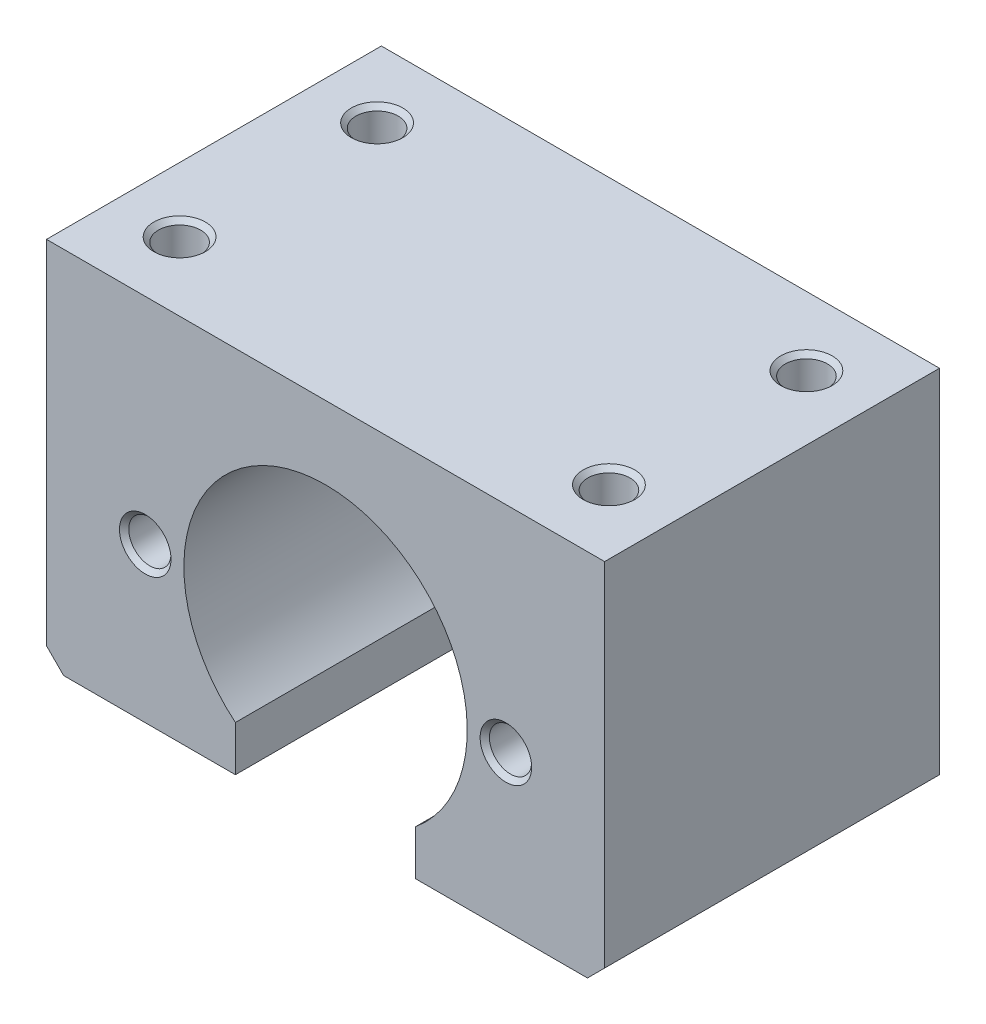
ISO-10303-21;
HEADER;
FILE_DESCRIPTION(('STEP AP214'),'2;1');
FILE_NAME('part.step','',(''),(''),'','','');
FILE_SCHEMA(('AUTOMOTIVE_DESIGN { 1 0 10303 214 1 1 1 1 }'));
ENDSEC;
DATA;
#1=APPLICATION_CONTEXT('core data for automotive mechanical design processes');
#2=APPLICATION_PROTOCOL_DEFINITION('international standard','automotive_design',2000,#1);
#3=PRODUCT_CONTEXT('',#1,'mechanical');
#4=PRODUCT('Part','Part','',(#3));
#5=PRODUCT_RELATED_PRODUCT_CATEGORY('part','',(#4));
#6=PRODUCT_DEFINITION_FORMATION('','',#4);
#7=PRODUCT_DEFINITION_CONTEXT('part definition',#1,'design');
#8=PRODUCT_DEFINITION('design','',#6,#7);
#9=PRODUCT_DEFINITION_SHAPE('','',#8);
#10=(LENGTH_UNIT() NAMED_UNIT(*) SI_UNIT(.MILLI.,.METRE.));
#11=(NAMED_UNIT(*) PLANE_ANGLE_UNIT() SI_UNIT($,.RADIAN.));
#12=(NAMED_UNIT(*) SI_UNIT($,.STERADIAN.) SOLID_ANGLE_UNIT());
#13=UNCERTAINTY_MEASURE_WITH_UNIT(LENGTH_MEASURE(1.E-05),#10,'distance_accuracy_value','');
#14=(GEOMETRIC_REPRESENTATION_CONTEXT(3) GLOBAL_UNCERTAINTY_ASSIGNED_CONTEXT((#13)) GLOBAL_UNIT_ASSIGNED_CONTEXT((#10,
#11,#12)) REPRESENTATION_CONTEXT('',''));
#15=CARTESIAN_POINT('',(0.,0.,0.));
#16=DIRECTION('',(0.,0.,1.));
#17=DIRECTION('',(1.,0.,0.));
#18=AXIS2_PLACEMENT_3D('',#15,#16,#17);
#19=CARTESIAN_POINT('',(32.5,25.,19.5));
#20=DIRECTION('',(0.,-1.,0.));
#21=DIRECTION('',(0.,0.,-1.));
#22=AXIS2_PLACEMENT_3D('',#19,#20,#21);
#23=PLANE('',#22);
#24=CARTESIAN_POINT('',(-25.,25.,11.5));
#25=DIRECTION('',(0.,1.,0.));
#26=DIRECTION('',(0.,0.,1.));
#27=AXIS2_PLACEMENT_3D('',#24,#25,#26);
#28=CIRCLE('',#27,3.);
#29=CARTESIAN_POINT('',(-25.,25.,14.5));
#30=VERTEX_POINT('',#29);
#31=EDGE_CURVE('E157',#30,#30,#28,.T.);
#32=ORIENTED_EDGE('',*,*,#31,.F.);
#33=EDGE_LOOP('',(#32));
#34=FACE_BOUND('',#33,.T.);
#35=CARTESIAN_POINT('',(25.,25.,11.5));
#36=DIRECTION('',(0.,1.,0.));
#37=DIRECTION('',(0.,0.,1.));
#38=AXIS2_PLACEMENT_3D('',#35,#36,#37);
#39=CIRCLE('',#38,3.);
#40=CARTESIAN_POINT('',(25.,25.,14.5));
#41=VERTEX_POINT('',#40);
#42=EDGE_CURVE('E162',#41,#41,#39,.T.);
#43=ORIENTED_EDGE('',*,*,#42,.F.);
#44=EDGE_LOOP('',(#43));
#45=FACE_BOUND('',#44,.T.);
#46=DIRECTION('',(0.,0.,-1.));
#47=VECTOR('',#46,1.);
#48=CARTESIAN_POINT('',(32.5,25.,19.5));
#49=LINE('',#48,#47);
#50=CARTESIAN_POINT('',(32.5,25.,19.5));
#51=VERTEX_POINT('',#50);
#52=CARTESIAN_POINT('',(32.5,25.,-19.5));
#53=VERTEX_POINT('',#52);
#54=EDGE_CURVE('E170',#51,#53,#49,.T.);
#55=ORIENTED_EDGE('',*,*,#54,.T.);
#56=DIRECTION('',(-1.,0.,0.));
#57=VECTOR('',#56,1.);
#58=CARTESIAN_POINT('',(32.5,25.,-19.5));
#59=LINE('',#58,#57);
#60=CARTESIAN_POINT('',(-32.5,25.,-19.5));
#61=VERTEX_POINT('',#60);
#62=EDGE_CURVE('E224',#53,#61,#59,.T.);
#63=ORIENTED_EDGE('',*,*,#62,.T.);
#64=DIRECTION('',(0.,0.,-1.));
#65=VECTOR('',#64,1.);
#66=CARTESIAN_POINT('',(-32.5,25.,19.5));
#67=LINE('',#66,#65);
#68=CARTESIAN_POINT('',(-32.5,25.,19.5));
#69=VERTEX_POINT('',#68);
#70=EDGE_CURVE('E11',#69,#61,#67,.T.);
#71=ORIENTED_EDGE('',*,*,#70,.F.);
#72=DIRECTION('',(-1.,0.,0.));
#73=VECTOR('',#72,1.);
#74=CARTESIAN_POINT('',(32.5,25.,19.5));
#75=LINE('',#74,#73);
#76=EDGE_CURVE('E252',#51,#69,#75,.T.);
#77=ORIENTED_EDGE('',*,*,#76,.F.);
#78=EDGE_LOOP('',(#55,#63,#71,#77));
#79=FACE_BOUND('',#78,.T.);
#80=CARTESIAN_POINT('',(25.,25.,-11.5));
#81=DIRECTION('',(0.,1.,0.));
#82=DIRECTION('',(0.,0.,1.));
#83=AXIS2_PLACEMENT_3D('',#80,#81,#82);
#84=CIRCLE('',#83,3.);
#85=CARTESIAN_POINT('',(25.,25.,-8.5));
#86=VERTEX_POINT('',#85);
#87=EDGE_CURVE('E171',#86,#86,#84,.T.);
#88=ORIENTED_EDGE('',*,*,#87,.F.);
#89=EDGE_LOOP('',(#88));
#90=FACE_BOUND('',#89,.T.);
#91=CARTESIAN_POINT('',(-25.,25.,-11.5));
#92=DIRECTION('',(0.,1.,0.));
#93=DIRECTION('',(0.,0.,1.));
#94=AXIS2_PLACEMENT_3D('',#91,#92,#93);
#95=CIRCLE('',#94,3.);
#96=CARTESIAN_POINT('',(-25.,25.,-8.5));
#97=VERTEX_POINT('',#96);
#98=EDGE_CURVE('E172',#97,#97,#95,.T.);
#99=ORIENTED_EDGE('',*,*,#98,.F.);
#100=EDGE_LOOP('',(#99));
#101=FACE_BOUND('',#100,.T.);
#102=ADVANCED_FACE('F43',(#34,#45,#79,#90,#101),#23,.F.);
#103=CARTESIAN_POINT('',(0.,0.,19.5));
#104=DIRECTION('',(0.,0.,-1.));
#105=DIRECTION('',(-1.,0.,0.));
#106=AXIS2_PLACEMENT_3D('',#103,#104,#105);
#107=PLANE('',#106);
#108=CARTESIAN_POINT('',(21.,0.,19.5));
#109=DIRECTION('',(0.,0.,1.));
#110=DIRECTION('',(1.,0.,0.));
#111=AXIS2_PLACEMENT_3D('',#108,#109,#110);
#112=CIRCLE('',#111,3.);
#113=CARTESIAN_POINT('',(24.,0.,19.5));
#114=VERTEX_POINT('',#113);
#115=EDGE_CURVE('E219',#114,#114,#112,.T.);
#116=ORIENTED_EDGE('',*,*,#115,.F.);
#117=EDGE_LOOP('',(#116));
#118=FACE_BOUND('',#117,.T.);
#119=ORIENTED_EDGE('',*,*,#76,.T.);
#120=DIRECTION('',(0.,-1.,0.));
#121=VECTOR('',#120,1.);
#122=CARTESIAN_POINT('',(-32.5,25.,19.5));
#123=LINE('',#122,#121);
#124=CARTESIAN_POINT('',(-32.5,-16.,19.5));
#125=VERTEX_POINT('',#124);
#126=EDGE_CURVE('E255',#69,#125,#123,.T.);
#127=ORIENTED_EDGE('',*,*,#126,.T.);
#128=DIRECTION('',(0.707106781186547,-0.707106781186547,0.));
#129=VECTOR('',#128,1.);
#130=CARTESIAN_POINT('',(-32.5,-16.,19.5));
#131=LINE('',#130,#129);
#132=CARTESIAN_POINT('',(-30.5,-18.,19.5));
#133=VERTEX_POINT('',#132);
#134=EDGE_CURVE('E258',#125,#133,#131,.T.);
#135=ORIENTED_EDGE('',*,*,#134,.T.);
#136=DIRECTION('',(1.,0.,0.));
#137=VECTOR('',#136,1.);
#138=CARTESIAN_POINT('',(-30.5,-18.,19.5));
#139=LINE('',#138,#137);
#140=CARTESIAN_POINT('',(-10.5,-18.,19.5));
#141=VERTEX_POINT('',#140);
#142=EDGE_CURVE('E256',#133,#141,#139,.T.);
#143=ORIENTED_EDGE('',*,*,#142,.T.);
#144=DIRECTION('',(0.,1.,0.));
#145=VECTOR('',#144,1.);
#146=CARTESIAN_POINT('',(-10.5,-18.,19.5));
#147=LINE('',#146,#145);
#148=CARTESIAN_POINT('',(-10.5,-12.7279220613579,19.5));
#149=VERTEX_POINT('',#148);
#150=EDGE_CURVE('E257',#141,#149,#147,.T.);
#151=ORIENTED_EDGE('',*,*,#150,.T.);
#152=CARTESIAN_POINT('',(0.,0.,19.5));
#153=DIRECTION('',(0.,0.,-1.));
#154=DIRECTION('',(-1.,0.,0.));
#155=AXIS2_PLACEMENT_3D('',#152,#153,#154);
#156=CIRCLE('',#155,16.5);
#157=CARTESIAN_POINT('',(10.5,-12.7279220613578,19.5));
#158=VERTEX_POINT('',#157);
#159=EDGE_CURVE('E265',#149,#158,#156,.T.);
#160=ORIENTED_EDGE('',*,*,#159,.T.);
#161=DIRECTION('',(0.,-1.,0.));
#162=VECTOR('',#161,1.);
#163=CARTESIAN_POINT('',(10.5,-12.7279220613579,19.5));
#164=LINE('',#163,#162);
#165=CARTESIAN_POINT('',(10.5,-18.,19.5));
#166=VERTEX_POINT('',#165);
#167=EDGE_CURVE('E262',#158,#166,#164,.T.);
#168=ORIENTED_EDGE('',*,*,#167,.T.);
#169=DIRECTION('',(1.,0.,0.));
#170=VECTOR('',#169,1.);
#171=CARTESIAN_POINT('',(10.5,-18.,19.5));
#172=LINE('',#171,#170);
#173=CARTESIAN_POINT('',(30.5,-18.,19.5));
#174=VERTEX_POINT('',#173);
#175=EDGE_CURVE('E266',#166,#174,#172,.T.);
#176=ORIENTED_EDGE('',*,*,#175,.T.);
#177=DIRECTION('',(0.707106781186547,0.707106781186547,0.));
#178=VECTOR('',#177,1.);
#179=CARTESIAN_POINT('',(30.5,-18.,19.5));
#180=LINE('',#179,#178);
#181=CARTESIAN_POINT('',(32.5,-16.,19.5));
#182=VERTEX_POINT('',#181);
#183=EDGE_CURVE('E61',#174,#182,#180,.T.);
#184=ORIENTED_EDGE('',*,*,#183,.T.);
#185=DIRECTION('',(0.,1.,0.));
#186=VECTOR('',#185,1.);
#187=CARTESIAN_POINT('',(32.5,-16.,19.5));
#188=LINE('',#187,#186);
#189=EDGE_CURVE('E60',#182,#51,#188,.T.);
#190=ORIENTED_EDGE('',*,*,#189,.T.);
#191=EDGE_LOOP('',(#119,#127,#135,#143,#151,#160,#168,#176,#184,#190));
#192=FACE_BOUND('',#191,.T.);
#193=CARTESIAN_POINT('',(-21.,0.,19.5));
#194=DIRECTION('',(0.,0.,1.));
#195=DIRECTION('',(1.,0.,0.));
#196=AXIS2_PLACEMENT_3D('',#193,#194,#195);
#197=CIRCLE('',#196,3.);
#198=CARTESIAN_POINT('',(-18.,0.,19.5));
#199=VERTEX_POINT('',#198);
#200=EDGE_CURVE('E211',#199,#199,#197,.T.);
#201=ORIENTED_EDGE('',*,*,#200,.F.);
#202=EDGE_LOOP('',(#201));
#203=FACE_BOUND('',#202,.T.);
#204=ADVANCED_FACE('F146',(#118,#192,#203),#107,.F.);
#205=CARTESIAN_POINT('',(-32.5,25.,19.5));
#206=DIRECTION('',(1.,0.,0.));
#207=DIRECTION('',(0.,0.,-1.));
#208=AXIS2_PLACEMENT_3D('',#205,#206,#207);
#209=PLANE('',#208);
#210=ORIENTED_EDGE('',*,*,#70,.T.);
#211=DIRECTION('',(0.,-1.,0.));
#212=VECTOR('',#211,1.);
#213=CARTESIAN_POINT('',(-32.5,25.,-19.5));
#214=LINE('',#213,#212);
#215=CARTESIAN_POINT('',(-32.5,-16.,-19.5));
#216=VERTEX_POINT('',#215);
#217=EDGE_CURVE('E223',#61,#216,#214,.T.);
#218=ORIENTED_EDGE('',*,*,#217,.T.);
#219=DIRECTION('',(0.,0.,-1.));
#220=VECTOR('',#219,1.);
#221=CARTESIAN_POINT('',(-32.5,-16.,19.5));
#222=LINE('',#221,#220);
#223=EDGE_CURVE('E49',#125,#216,#222,.T.);
#224=ORIENTED_EDGE('',*,*,#223,.F.);
#225=ORIENTED_EDGE('',*,*,#126,.F.);
#226=EDGE_LOOP('',(#210,#218,#224,#225));
#227=FACE_BOUND('',#226,.T.);
#228=ADVANCED_FACE('F153',(#227),#209,.F.);
#229=CARTESIAN_POINT('',(-32.5,-16.,19.5));
#230=DIRECTION('',(0.707106781186548,0.707106781186548,0.));
#231=DIRECTION('',(-0.707106781186548,0.707106781186548,0.));
#232=AXIS2_PLACEMENT_3D('',#229,#230,#231);
#233=PLANE('',#232);
#234=ORIENTED_EDGE('',*,*,#223,.T.);
#235=DIRECTION('',(0.707106781186547,-0.707106781186547,0.));
#236=VECTOR('',#235,1.);
#237=CARTESIAN_POINT('',(-32.5,-16.,-19.5));
#238=LINE('',#237,#236);
#239=CARTESIAN_POINT('',(-30.5,-18.,-19.5));
#240=VERTEX_POINT('',#239);
#241=EDGE_CURVE('E230',#216,#240,#238,.T.);
#242=ORIENTED_EDGE('',*,*,#241,.T.);
#243=DIRECTION('',(0.,0.,-1.));
#244=VECTOR('',#243,1.);
#245=CARTESIAN_POINT('',(-30.5,-18.,19.5));
#246=LINE('',#245,#244);
#247=EDGE_CURVE('E285',#133,#240,#246,.T.);
#248=ORIENTED_EDGE('',*,*,#247,.F.);
#249=ORIENTED_EDGE('',*,*,#134,.F.);
#250=EDGE_LOOP('',(#234,#242,#248,#249));
#251=FACE_BOUND('',#250,.T.);
#252=ADVANCED_FACE('F290',(#251),#233,.F.);
#253=CARTESIAN_POINT('',(-30.5,-18.,19.5));
#254=DIRECTION('',(0.,1.,0.));
#255=DIRECTION('',(0.,0.,1.));
#256=AXIS2_PLACEMENT_3D('',#253,#254,#255);
#257=PLANE('',#256);
#258=ORIENTED_EDGE('',*,*,#247,.T.);
#259=DIRECTION('',(1.,0.,0.));
#260=VECTOR('',#259,1.);
#261=CARTESIAN_POINT('',(-30.5,-18.,-19.5));
#262=LINE('',#261,#260);
#263=CARTESIAN_POINT('',(-10.5,-18.,-19.5));
#264=VERTEX_POINT('',#263);
#265=EDGE_CURVE('E234',#240,#264,#262,.T.);
#266=ORIENTED_EDGE('',*,*,#265,.T.);
#267=DIRECTION('',(0.,0.,-1.));
#268=VECTOR('',#267,1.);
#269=CARTESIAN_POINT('',(-10.5,-18.,19.5));
#270=LINE('',#269,#268);
#271=EDGE_CURVE('E284',#141,#264,#270,.T.);
#272=ORIENTED_EDGE('',*,*,#271,.F.);
#273=ORIENTED_EDGE('',*,*,#142,.F.);
#274=EDGE_LOOP('',(#258,#266,#272,#273));
#275=FACE_BOUND('',#274,.T.);
#276=ADVANCED_FACE('F322',(#275),#257,.F.);
#277=CARTESIAN_POINT('',(-10.5,-18.,19.5));
#278=DIRECTION('',(-1.,0.,0.));
#279=DIRECTION('',(0.,0.,1.));
#280=AXIS2_PLACEMENT_3D('',#277,#278,#279);
#281=PLANE('',#280);
#282=ORIENTED_EDGE('',*,*,#271,.T.);
#283=DIRECTION('',(0.,1.,0.));
#284=VECTOR('',#283,1.);
#285=CARTESIAN_POINT('',(-10.5,-18.,-19.5));
#286=LINE('',#285,#284);
#287=CARTESIAN_POINT('',(-10.5,-12.7279220613579,-19.5));
#288=VERTEX_POINT('',#287);
#289=EDGE_CURVE('E233',#264,#288,#286,.T.);
#290=ORIENTED_EDGE('',*,*,#289,.T.);
#291=DIRECTION('',(0.,0.,-1.));
#292=VECTOR('',#291,1.);
#293=CARTESIAN_POINT('',(-10.5,-12.7279220613579,19.5));
#294=LINE('',#293,#292);
#295=EDGE_CURVE('E276',#149,#288,#294,.T.);
#296=ORIENTED_EDGE('',*,*,#295,.F.);
#297=ORIENTED_EDGE('',*,*,#150,.F.);
#298=EDGE_LOOP('',(#282,#290,#296,#297));
#299=FACE_BOUND('',#298,.T.);
#300=ADVANCED_FACE('F321',(#299),#281,.F.);
#301=CARTESIAN_POINT('',(0.,0.,19.5));
#302=DIRECTION('',(0.,0.,-1.));
#303=DIRECTION('',(-1.,0.,0.));
#304=AXIS2_PLACEMENT_3D('',#301,#302,#303);
#305=CYLINDRICAL_SURFACE('',#304,16.5);
#306=ORIENTED_EDGE('',*,*,#295,.T.);
#307=CARTESIAN_POINT('',(0.,0.,-19.5));
#308=DIRECTION('',(0.,0.,-1.));
#309=DIRECTION('',(-1.,0.,0.));
#310=AXIS2_PLACEMENT_3D('',#307,#308,#309);
#311=CIRCLE('',#310,16.5);
#312=CARTESIAN_POINT('',(10.5,-12.7279220613578,-19.5));
#313=VERTEX_POINT('',#312);
#314=EDGE_CURVE('E240',#288,#313,#311,.T.);
#315=ORIENTED_EDGE('',*,*,#314,.T.);
#316=DIRECTION('',(0.,0.,-1.));
#317=VECTOR('',#316,1.);
#318=CARTESIAN_POINT('',(10.5,-12.7279220613578,19.5));
#319=LINE('',#318,#317);
#320=EDGE_CURVE('E280',#158,#313,#319,.T.);
#321=ORIENTED_EDGE('',*,*,#320,.F.);
#322=ORIENTED_EDGE('',*,*,#159,.F.);
#323=EDGE_LOOP('',(#306,#315,#321,#322));
#324=FACE_BOUND('',#323,.T.);
#325=ADVANCED_FACE('F316',(#324),#305,.F.);
#326=CARTESIAN_POINT('',(10.5,-12.7279220613579,19.5));
#327=DIRECTION('',(1.,0.,0.));
#328=DIRECTION('',(0.,0.,-1.));
#329=AXIS2_PLACEMENT_3D('',#326,#327,#328);
#330=PLANE('',#329);
#331=ORIENTED_EDGE('',*,*,#320,.T.);
#332=DIRECTION('',(0.,-1.,0.));
#333=VECTOR('',#332,1.);
#334=CARTESIAN_POINT('',(10.5,-12.7279220613579,-19.5));
#335=LINE('',#334,#333);
#336=CARTESIAN_POINT('',(10.5,-18.,-19.5));
#337=VERTEX_POINT('',#336);
#338=EDGE_CURVE('E238',#313,#337,#335,.T.);
#339=ORIENTED_EDGE('',*,*,#338,.T.);
#340=DIRECTION('',(0.,0.,-1.));
#341=VECTOR('',#340,1.);
#342=CARTESIAN_POINT('',(10.5,-18.,19.5));
#343=LINE('',#342,#341);
#344=EDGE_CURVE('E274',#166,#337,#343,.T.);
#345=ORIENTED_EDGE('',*,*,#344,.F.);
#346=ORIENTED_EDGE('',*,*,#167,.F.);
#347=EDGE_LOOP('',(#331,#339,#345,#346));
#348=FACE_BOUND('',#347,.T.);
#349=ADVANCED_FACE('F315',(#348),#330,.F.);
#350=CARTESIAN_POINT('',(10.5,-18.,19.5));
#351=DIRECTION('',(0.,1.,0.));
#352=DIRECTION('',(0.,0.,1.));
#353=AXIS2_PLACEMENT_3D('',#350,#351,#352);
#354=PLANE('',#353);
#355=ORIENTED_EDGE('',*,*,#344,.T.);
#356=DIRECTION('',(1.,0.,0.));
#357=VECTOR('',#356,1.);
#358=CARTESIAN_POINT('',(10.5,-18.,-19.5));
#359=LINE('',#358,#357);
#360=CARTESIAN_POINT('',(30.5,-18.,-19.5));
#361=VERTEX_POINT('',#360);
#362=EDGE_CURVE('E245',#337,#361,#359,.T.);
#363=ORIENTED_EDGE('',*,*,#362,.T.);
#364=DIRECTION('',(0.,0.,-1.));
#365=VECTOR('',#364,1.);
#366=CARTESIAN_POINT('',(30.5,-18.,19.5));
#367=LINE('',#366,#365);
#368=EDGE_CURVE('E272',#174,#361,#367,.T.);
#369=ORIENTED_EDGE('',*,*,#368,.F.);
#370=ORIENTED_EDGE('',*,*,#175,.F.);
#371=EDGE_LOOP('',(#355,#363,#369,#370));
#372=FACE_BOUND('',#371,.T.);
#373=ADVANCED_FACE('F307',(#372),#354,.F.);
#374=CARTESIAN_POINT('',(30.5,-18.,19.5));
#375=DIRECTION('',(-0.707106781186548,0.707106781186548,0.));
#376=DIRECTION('',(-0.707106781186548,-0.707106781186548,0.));
#377=AXIS2_PLACEMENT_3D('',#374,#375,#376);
#378=PLANE('',#377);
#379=ORIENTED_EDGE('',*,*,#368,.T.);
#380=DIRECTION('',(0.707106781186547,0.707106781186547,0.));
#381=VECTOR('',#380,1.);
#382=CARTESIAN_POINT('',(30.5,-18.,-19.5));
#383=LINE('',#382,#381);
#384=CARTESIAN_POINT('',(32.5,-16.,-19.5));
#385=VERTEX_POINT('',#384);
#386=EDGE_CURVE('E249',#361,#385,#383,.T.);
#387=ORIENTED_EDGE('',*,*,#386,.T.);
#388=DIRECTION('',(0.,0.,-1.));
#389=VECTOR('',#388,1.);
#390=CARTESIAN_POINT('',(32.5,-16.,19.5));
#391=LINE('',#390,#389);
#392=EDGE_CURVE('E271',#182,#385,#391,.T.);
#393=ORIENTED_EDGE('',*,*,#392,.F.);
#394=ORIENTED_EDGE('',*,*,#183,.F.);
#395=EDGE_LOOP('',(#379,#387,#393,#394));
#396=FACE_BOUND('',#395,.T.);
#397=ADVANCED_FACE('F301',(#396),#378,.F.);
#398=CARTESIAN_POINT('',(32.5,-16.,19.5));
#399=DIRECTION('',(-1.,0.,0.));
#400=DIRECTION('',(0.,0.,1.));
#401=AXIS2_PLACEMENT_3D('',#398,#399,#400);
#402=PLANE('',#401);
#403=ORIENTED_EDGE('',*,*,#392,.T.);
#404=DIRECTION('',(0.,1.,0.));
#405=VECTOR('',#404,1.);
#406=CARTESIAN_POINT('',(32.5,-16.,-19.5));
#407=LINE('',#406,#405);
#408=EDGE_CURVE('E248',#385,#53,#407,.T.);
#409=ORIENTED_EDGE('',*,*,#408,.T.);
#410=ORIENTED_EDGE('',*,*,#54,.F.);
#411=ORIENTED_EDGE('',*,*,#189,.F.);
#412=EDGE_LOOP('',(#403,#409,#410,#411));
#413=FACE_BOUND('',#412,.T.);
#414=ADVANCED_FACE('F297',(#413),#402,.F.);
#415=CARTESIAN_POINT('',(0.,0.,-19.5));
#416=DIRECTION('',(0.,0.,-1.));
#417=DIRECTION('',(-1.,0.,0.));
#418=AXIS2_PLACEMENT_3D('',#415,#416,#417);
#419=PLANE('',#418);
#420=ORIENTED_EDGE('',*,*,#62,.F.);
#421=ORIENTED_EDGE('',*,*,#408,.F.);
#422=ORIENTED_EDGE('',*,*,#386,.F.);
#423=ORIENTED_EDGE('',*,*,#362,.F.);
#424=ORIENTED_EDGE('',*,*,#338,.F.);
#425=ORIENTED_EDGE('',*,*,#314,.F.);
#426=ORIENTED_EDGE('',*,*,#289,.F.);
#427=ORIENTED_EDGE('',*,*,#265,.F.);
#428=ORIENTED_EDGE('',*,*,#241,.F.);
#429=ORIENTED_EDGE('',*,*,#217,.F.);
#430=EDGE_LOOP('',(#420,#421,#422,#423,#424,#425,#426,#427,#428,#429));
#431=FACE_BOUND('',#430,.T.);
#432=ADVANCED_FACE('F294',(#431),#419,.T.);
#433=CARTESIAN_POINT('',(21.,0.,18.9585));
#434=DIRECTION('',(0.,0.,1.));
#435=DIRECTION('',(1.,0.,0.));
#436=AXIS2_PLACEMENT_3D('',#433,#434,#435);
#437=CONICAL_SURFACE('',#436,2.4585,0.785398163397448);
#438=ORIENTED_EDGE('',*,*,#115,.T.);
#439=EDGE_LOOP('',(#438));
#440=FACE_BOUND('',#439,.T.);
#441=CARTESIAN_POINT('',(21.,0.,18.9585));
#442=DIRECTION('',(0.,0.,1.));
#443=DIRECTION('',(1.,0.,0.));
#444=AXIS2_PLACEMENT_3D('',#441,#442,#443);
#445=CIRCLE('',#444,2.4585);
#446=CARTESIAN_POINT('',(23.4585,0.,18.9585));
#447=VERTEX_POINT('',#446);
#448=EDGE_CURVE('E220',#447,#447,#445,.T.);
#449=ORIENTED_EDGE('',*,*,#448,.F.);
#450=EDGE_LOOP('',(#449));
#451=FACE_BOUND('',#450,.T.);
#452=ADVANCED_FACE('F363',(#440,#451),#437,.F.);
#453=CARTESIAN_POINT('',(21.,0.,6.08058436319731));
#454=DIRECTION('',(0.,0.,1.));
#455=DIRECTION('',(1.,0.,0.));
#456=AXIS2_PLACEMENT_3D('',#453,#454,#455);
#457=CYLINDRICAL_SURFACE('',#456,2.4585);
#458=ORIENTED_EDGE('',*,*,#448,.T.);
#459=EDGE_LOOP('',(#458));
#460=FACE_BOUND('',#459,.T.);
#461=CARTESIAN_POINT('',(21.,0.,7.5));
#462=DIRECTION('',(0.,0.,1.));
#463=DIRECTION('',(1.,0.,0.));
#464=AXIS2_PLACEMENT_3D('',#461,#462,#463);
#465=CIRCLE('',#464,2.4585);
#466=CARTESIAN_POINT('',(23.4585,0.,7.5));
#467=VERTEX_POINT('',#466);
#468=EDGE_CURVE('E212',#467,#467,#465,.T.);
#469=ORIENTED_EDGE('',*,*,#468,.F.);
#470=EDGE_LOOP('',(#469));
#471=FACE_BOUND('',#470,.T.);
#472=ADVANCED_FACE('F356',(#460,#471),#457,.F.);
#473=CARTESIAN_POINT('',(21.,0.,6.08058436319731));
#474=DIRECTION('',(0.,0.,1.));
#475=DIRECTION('',(1.,0.,0.));
#476=AXIS2_PLACEMENT_3D('',#473,#474,#475);
#477=CONICAL_SURFACE('',#476,0.,1.0471975511966);
#478=ORIENTED_EDGE('',*,*,#468,.T.);
#479=EDGE_LOOP('',(#478));
#480=FACE_BOUND('',#479,.T.);
#481=CARTESIAN_POINT('',(21.,0.,6.08058436319731));
#482=VERTEX_POINT('',#481);
#483=VERTEX_LOOP('',#482);
#484=FACE_BOUND('',#483,.T.);
#485=ADVANCED_FACE('F334',(#480,#484),#477,.F.);
#486=CARTESIAN_POINT('',(-21.,0.,18.9585));
#487=DIRECTION('',(0.,0.,1.));
#488=DIRECTION('',(1.,0.,0.));
#489=AXIS2_PLACEMENT_3D('',#486,#487,#488);
#490=CONICAL_SURFACE('',#489,2.4585,0.785398163397448);
#491=ORIENTED_EDGE('',*,*,#200,.T.);
#492=EDGE_LOOP('',(#491));
#493=FACE_BOUND('',#492,.T.);
#494=CARTESIAN_POINT('',(-21.,0.,18.9585));
#495=DIRECTION('',(0.,0.,1.));
#496=DIRECTION('',(1.,0.,0.));
#497=AXIS2_PLACEMENT_3D('',#494,#495,#496);
#498=CIRCLE('',#497,2.4585);
#499=CARTESIAN_POINT('',(-18.5415,0.,18.9585));
#500=VERTEX_POINT('',#499);
#501=EDGE_CURVE('E208',#500,#500,#498,.T.);
#502=ORIENTED_EDGE('',*,*,#501,.F.);
#503=EDGE_LOOP('',(#502));
#504=FACE_BOUND('',#503,.T.);
#505=ADVANCED_FACE('F328',(#493,#504),#490,.F.);
#506=CARTESIAN_POINT('',(-21.,0.,6.08058436319731));
#507=DIRECTION('',(0.,0.,1.));
#508=DIRECTION('',(1.,0.,0.));
#509=AXIS2_PLACEMENT_3D('',#506,#507,#508);
#510=CYLINDRICAL_SURFACE('',#509,2.4585);
#511=ORIENTED_EDGE('',*,*,#501,.T.);
#512=EDGE_LOOP('',(#511));
#513=FACE_BOUND('',#512,.T.);
#514=CARTESIAN_POINT('',(-21.,0.,7.5));
#515=DIRECTION('',(0.,0.,1.));
#516=DIRECTION('',(1.,0.,0.));
#517=AXIS2_PLACEMENT_3D('',#514,#515,#516);
#518=CIRCLE('',#517,2.4585);
#519=CARTESIAN_POINT('',(-18.5415,0.,7.5));
#520=VERTEX_POINT('',#519);
#521=EDGE_CURVE('E202',#520,#520,#518,.T.);
#522=ORIENTED_EDGE('',*,*,#521,.F.);
#523=EDGE_LOOP('',(#522));
#524=FACE_BOUND('',#523,.T.);
#525=ADVANCED_FACE('F335',(#513,#524),#510,.F.);
#526=CARTESIAN_POINT('',(-21.,0.,6.08058436319731));
#527=DIRECTION('',(0.,0.,1.));
#528=DIRECTION('',(1.,0.,0.));
#529=AXIS2_PLACEMENT_3D('',#526,#527,#528);
#530=CONICAL_SURFACE('',#529,0.,1.0471975511966);
#531=ORIENTED_EDGE('',*,*,#521,.T.);
#532=EDGE_LOOP('',(#531));
#533=FACE_BOUND('',#532,.T.);
#534=CARTESIAN_POINT('',(-21.,0.,6.08058436319731));
#535=VERTEX_POINT('',#534);
#536=VERTEX_LOOP('',#535);
#537=FACE_BOUND('',#536,.T.);
#538=ADVANCED_FACE('F338',(#533,#537),#530,.F.);
#539=CARTESIAN_POINT('',(25.,24.4585,11.5));
#540=DIRECTION('',(0.,1.,0.));
#541=DIRECTION('',(0.,0.,1.));
#542=AXIS2_PLACEMENT_3D('',#539,#540,#541);
#543=CONICAL_SURFACE('',#542,2.4585,0.785398163397447);
#544=ORIENTED_EDGE('',*,*,#42,.T.);
#545=EDGE_LOOP('',(#544));
#546=FACE_BOUND('',#545,.T.);
#547=CARTESIAN_POINT('',(25.,24.4585,11.5));
#548=DIRECTION('',(0.,1.,0.));
#549=DIRECTION('',(0.,0.,1.));
#550=AXIS2_PLACEMENT_3D('',#547,#548,#549);
#551=CIRCLE('',#550,2.4585);
#552=CARTESIAN_POINT('',(25.,24.4585,13.9585));
#553=VERTEX_POINT('',#552);
#554=EDGE_CURVE('E203',#553,#553,#551,.T.);
#555=ORIENTED_EDGE('',*,*,#554,.F.);
#556=EDGE_LOOP('',(#555));
#557=FACE_BOUND('',#556,.T.);
#558=ADVANCED_FACE('F342',(#546,#557),#543,.F.);
#559=CARTESIAN_POINT('',(25.,9.5805843631973,11.5));
#560=DIRECTION('',(0.,1.,0.));
#561=DIRECTION('',(0.,0.,1.));
#562=AXIS2_PLACEMENT_3D('',#559,#560,#561);
#563=CYLINDRICAL_SURFACE('',#562,2.4585);
#564=ORIENTED_EDGE('',*,*,#554,.T.);
#565=EDGE_LOOP('',(#564));
#566=FACE_BOUND('',#565,.T.);
#567=CARTESIAN_POINT('',(25.,11.,11.5));
#568=DIRECTION('',(0.,1.,0.));
#569=DIRECTION('',(0.,0.,1.));
#570=AXIS2_PLACEMENT_3D('',#567,#568,#569);
#571=CIRCLE('',#570,2.4585);
#572=CARTESIAN_POINT('',(25.,11.,13.9585));
#573=VERTEX_POINT('',#572);
#574=EDGE_CURVE('E196',#573,#573,#571,.T.);
#575=ORIENTED_EDGE('',*,*,#574,.F.);
#576=EDGE_LOOP('',(#575));
#577=FACE_BOUND('',#576,.T.);
#578=ADVANCED_FACE('F348',(#566,#577),#563,.F.);
#579=CARTESIAN_POINT('',(25.,9.5805843631973,11.5));
#580=DIRECTION('',(0.,1.,0.));
#581=DIRECTION('',(0.,0.,1.));
#582=AXIS2_PLACEMENT_3D('',#579,#580,#581);
#583=CONICAL_SURFACE('',#582,0.,1.0471975511966);
#584=ORIENTED_EDGE('',*,*,#574,.T.);
#585=EDGE_LOOP('',(#584));
#586=FACE_BOUND('',#585,.T.);
#587=CARTESIAN_POINT('',(25.,9.5805843631973,11.5));
#588=VERTEX_POINT('',#587);
#589=VERTEX_LOOP('',#588);
#590=FACE_BOUND('',#589,.T.);
#591=ADVANCED_FACE('F469',(#586,#590),#583,.F.);
#592=CARTESIAN_POINT('',(25.,24.4585,-11.5));
#593=DIRECTION('',(0.,1.,0.));
#594=DIRECTION('',(0.,0.,1.));
#595=AXIS2_PLACEMENT_3D('',#592,#593,#594);
#596=CONICAL_SURFACE('',#595,2.4585,0.785398163397448);
#597=ORIENTED_EDGE('',*,*,#87,.T.);
#598=EDGE_LOOP('',(#597));
#599=FACE_BOUND('',#598,.T.);
#600=CARTESIAN_POINT('',(25.,24.4585,-11.5));
#601=DIRECTION('',(0.,1.,0.));
#602=DIRECTION('',(0.,0.,1.));
#603=AXIS2_PLACEMENT_3D('',#600,#601,#602);
#604=CIRCLE('',#603,2.4585);
#605=CARTESIAN_POINT('',(25.,24.4585,-9.0415));
#606=VERTEX_POINT('',#605);
#607=EDGE_CURVE('E193',#606,#606,#604,.T.);
#608=ORIENTED_EDGE('',*,*,#607,.F.);
#609=EDGE_LOOP('',(#608));
#610=FACE_BOUND('',#609,.T.);
#611=ADVANCED_FACE('F478',(#599,#610),#596,.F.);
#612=CARTESIAN_POINT('',(25.,9.58058436319731,-11.5));
#613=DIRECTION('',(0.,1.,0.));
#614=DIRECTION('',(0.,0.,1.));
#615=AXIS2_PLACEMENT_3D('',#612,#613,#614);
#616=CYLINDRICAL_SURFACE('',#615,2.4585);
#617=ORIENTED_EDGE('',*,*,#607,.T.);
#618=EDGE_LOOP('',(#617));
#619=FACE_BOUND('',#618,.T.);
#620=CARTESIAN_POINT('',(25.,11.,-11.5));
#621=DIRECTION('',(0.,1.,0.));
#622=DIRECTION('',(0.,0.,1.));
#623=AXIS2_PLACEMENT_3D('',#620,#621,#622);
#624=CIRCLE('',#623,2.4585);
#625=CARTESIAN_POINT('',(25.,11.,-9.0415));
#626=VERTEX_POINT('',#625);
#627=EDGE_CURVE('E194',#626,#626,#624,.T.);
#628=ORIENTED_EDGE('',*,*,#627,.F.);
#629=EDGE_LOOP('',(#628));
#630=FACE_BOUND('',#629,.T.);
#631=ADVANCED_FACE('F486',(#619,#630),#616,.F.);
#632=CARTESIAN_POINT('',(25.,9.58058436319731,-11.5));
#633=DIRECTION('',(0.,1.,0.));
#634=DIRECTION('',(0.,0.,1.));
#635=AXIS2_PLACEMENT_3D('',#632,#633,#634);
#636=CONICAL_SURFACE('',#635,0.,1.0471975511966);
#637=ORIENTED_EDGE('',*,*,#627,.T.);
#638=EDGE_LOOP('',(#637));
#639=FACE_BOUND('',#638,.T.);
#640=CARTESIAN_POINT('',(25.,9.58058436319731,-11.5));
#641=VERTEX_POINT('',#640);
#642=VERTEX_LOOP('',#641);
#643=FACE_BOUND('',#642,.T.);
#644=ADVANCED_FACE('F500',(#639,#643),#636,.F.);
#645=CARTESIAN_POINT('',(-25.,24.4585,11.5));
#646=DIRECTION('',(0.,1.,0.));
#647=DIRECTION('',(0.,0.,1.));
#648=AXIS2_PLACEMENT_3D('',#645,#646,#647);
#649=CONICAL_SURFACE('',#648,2.4585,0.785398163397447);
#650=ORIENTED_EDGE('',*,*,#31,.T.);
#651=EDGE_LOOP('',(#650));
#652=FACE_BOUND('',#651,.T.);
#653=CARTESIAN_POINT('',(-25.,24.4585,11.5));
#654=DIRECTION('',(0.,1.,0.));
#655=DIRECTION('',(0.,0.,1.));
#656=AXIS2_PLACEMENT_3D('',#653,#654,#655);
#657=CIRCLE('',#656,2.4585);
#658=CARTESIAN_POINT('',(-25.,24.4585,13.9585));
#659=VERTEX_POINT('',#658);
#660=EDGE_CURVE('E182',#659,#659,#657,.T.);
#661=ORIENTED_EDGE('',*,*,#660,.F.);
#662=EDGE_LOOP('',(#661));
#663=FACE_BOUND('',#662,.T.);
#664=ADVANCED_FACE('F510',(#652,#663),#649,.F.);
#665=CARTESIAN_POINT('',(-25.,9.5805843631973,11.5));
#666=DIRECTION('',(0.,1.,0.));
#667=DIRECTION('',(0.,0.,1.));
#668=AXIS2_PLACEMENT_3D('',#665,#666,#667);
#669=CYLINDRICAL_SURFACE('',#668,2.4585);
#670=ORIENTED_EDGE('',*,*,#660,.T.);
#671=EDGE_LOOP('',(#670));
#672=FACE_BOUND('',#671,.T.);
#673=CARTESIAN_POINT('',(-25.,11.,11.5));
#674=DIRECTION('',(0.,1.,0.));
#675=DIRECTION('',(0.,0.,1.));
#676=AXIS2_PLACEMENT_3D('',#673,#674,#675);
#677=CIRCLE('',#676,2.4585);
#678=CARTESIAN_POINT('',(-25.,11.,13.9585));
#679=VERTEX_POINT('',#678);
#680=EDGE_CURVE('E176',#679,#679,#677,.T.);
#681=ORIENTED_EDGE('',*,*,#680,.F.);
#682=EDGE_LOOP('',(#681));
#683=FACE_BOUND('',#682,.T.);
#684=ADVANCED_FACE('F520',(#672,#683),#669,.F.);
#685=CARTESIAN_POINT('',(-25.,9.5805843631973,11.5));
#686=DIRECTION('',(0.,1.,0.));
#687=DIRECTION('',(0.,0.,1.));
#688=AXIS2_PLACEMENT_3D('',#685,#686,#687);
#689=CONICAL_SURFACE('',#688,0.,1.0471975511966);
#690=ORIENTED_EDGE('',*,*,#680,.T.);
#691=EDGE_LOOP('',(#690));
#692=FACE_BOUND('',#691,.T.);
#693=CARTESIAN_POINT('',(-25.,9.5805843631973,11.5));
#694=VERTEX_POINT('',#693);
#695=VERTEX_LOOP('',#694);
#696=FACE_BOUND('',#695,.T.);
#697=ADVANCED_FACE('F530',(#692,#696),#689,.F.);
#698=CARTESIAN_POINT('',(-25.,24.4585,-11.5));
#699=DIRECTION('',(0.,1.,0.));
#700=DIRECTION('',(0.,0.,1.));
#701=AXIS2_PLACEMENT_3D('',#698,#699,#700);
#702=CONICAL_SURFACE('',#701,2.4585,0.785398163397448);
#703=ORIENTED_EDGE('',*,*,#98,.T.);
#704=EDGE_LOOP('',(#703));
#705=FACE_BOUND('',#704,.T.);
#706=CARTESIAN_POINT('',(-25.,24.4585,-11.5));
#707=DIRECTION('',(0.,1.,0.));
#708=DIRECTION('',(0.,0.,1.));
#709=AXIS2_PLACEMENT_3D('',#706,#707,#708);
#710=CIRCLE('',#709,2.4585);
#711=CARTESIAN_POINT('',(-25.,24.4585,-9.0415));
#712=VERTEX_POINT('',#711);
#713=EDGE_CURVE('E180',#712,#712,#710,.T.);
#714=ORIENTED_EDGE('',*,*,#713,.F.);
#715=EDGE_LOOP('',(#714));
#716=FACE_BOUND('',#715,.T.);
#717=ADVANCED_FACE('F141',(#705,#716),#702,.F.);
#718=CARTESIAN_POINT('',(-25.,9.58058436319731,-11.5));
#719=DIRECTION('',(0.,1.,0.));
#720=DIRECTION('',(0.,0.,1.));
#721=AXIS2_PLACEMENT_3D('',#718,#719,#720);
#722=CYLINDRICAL_SURFACE('',#721,2.4585);
#723=ORIENTED_EDGE('',*,*,#713,.T.);
#724=EDGE_LOOP('',(#723));
#725=FACE_BOUND('',#724,.T.);
#726=CARTESIAN_POINT('',(-25.,11.,-11.5));
#727=DIRECTION('',(0.,1.,0.));
#728=DIRECTION('',(0.,0.,1.));
#729=AXIS2_PLACEMENT_3D('',#726,#727,#728);
#730=CIRCLE('',#729,2.4585);
#731=CARTESIAN_POINT('',(-25.,11.,-9.0415));
#732=VERTEX_POINT('',#731);
#733=EDGE_CURVE('E184',#732,#732,#730,.T.);
#734=ORIENTED_EDGE('',*,*,#733,.F.);
#735=EDGE_LOOP('',(#734));
#736=FACE_BOUND('',#735,.T.);
#737=ADVANCED_FACE('F139',(#725,#736),#722,.F.);
#738=CARTESIAN_POINT('',(-25.,9.58058436319731,-11.5));
#739=DIRECTION('',(0.,1.,0.));
#740=DIRECTION('',(0.,0.,1.));
#741=AXIS2_PLACEMENT_3D('',#738,#739,#740);
#742=CONICAL_SURFACE('',#741,0.,1.0471975511966);
#743=ORIENTED_EDGE('',*,*,#733,.T.);
#744=EDGE_LOOP('',(#743));
#745=FACE_BOUND('',#744,.T.);
#746=CARTESIAN_POINT('',(-25.,9.58058436319731,-11.5));
#747=VERTEX_POINT('',#746);
#748=VERTEX_LOOP('',#747);
#749=FACE_BOUND('',#748,.T.);
#750=ADVANCED_FACE('F133',(#745,#749),#742,.F.);
#751=CLOSED_SHELL('',(#102,#204,#228,#252,#276,#300,#325,#349,#373,#397,#414,#432,#452,#472,
#485,#505,#525,#538,#558,#578,#591,#611,#631,#644,#664,#684,#697,#717,#737,#750));
#752=MANIFOLD_SOLID_BREP('B2',#751);
#753=ADVANCED_BREP_SHAPE_REPRESENTATION('',(#18,#752),#14);
#754=SHAPE_DEFINITION_REPRESENTATION(#9,#753);
ENDSEC;
END-ISO-10303-21;
